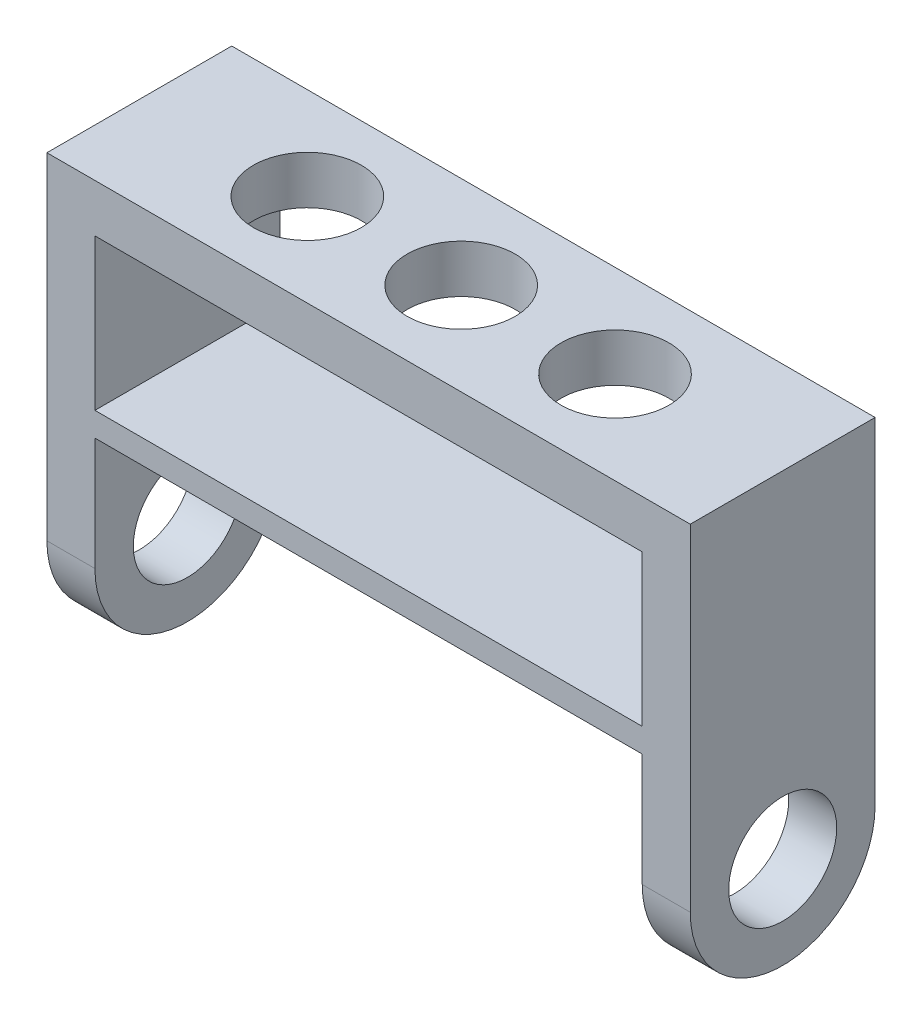
ISO-10303-21;
HEADER;
FILE_DESCRIPTION(('STEP AP214'),'2;1');
FILE_NAME('part.step','',(''),(''),'','','');
FILE_SCHEMA(('AUTOMOTIVE_DESIGN { 1 0 10303 214 1 1 1 1 }'));
ENDSEC;
DATA;
#1=APPLICATION_CONTEXT('core data for automotive mechanical design processes');
#2=APPLICATION_PROTOCOL_DEFINITION('international standard','automotive_design',2000,#1);
#3=PRODUCT_CONTEXT('',#1,'mechanical');
#4=PRODUCT('Part','Part','',(#3));
#5=PRODUCT_RELATED_PRODUCT_CATEGORY('part','',(#4));
#6=PRODUCT_DEFINITION_FORMATION('','',#4);
#7=PRODUCT_DEFINITION_CONTEXT('part definition',#1,'design');
#8=PRODUCT_DEFINITION('design','',#6,#7);
#9=PRODUCT_DEFINITION_SHAPE('','',#8);
#10=(LENGTH_UNIT() NAMED_UNIT(*) SI_UNIT(.MILLI.,.METRE.));
#11=(NAMED_UNIT(*) PLANE_ANGLE_UNIT() SI_UNIT($,.RADIAN.));
#12=(NAMED_UNIT(*) SI_UNIT($,.STERADIAN.) SOLID_ANGLE_UNIT());
#13=UNCERTAINTY_MEASURE_WITH_UNIT(LENGTH_MEASURE(1.E-05),#10,'distance_accuracy_value','');
#14=(GEOMETRIC_REPRESENTATION_CONTEXT(3) GLOBAL_UNCERTAINTY_ASSIGNED_CONTEXT((#13)) GLOBAL_UNIT_ASSIGNED_CONTEXT((#10,
#11,#12)) REPRESENTATION_CONTEXT('',''));
#15=CARTESIAN_POINT('',(0.,0.,0.));
#16=DIRECTION('',(0.,0.,1.));
#17=DIRECTION('',(1.,0.,0.));
#18=AXIS2_PLACEMENT_3D('',#15,#16,#17);
#19=CARTESIAN_POINT('',(0.,0.,0.));
#20=DIRECTION('',(1.,0.,0.));
#21=DIRECTION('',(0.,0.,-1.));
#22=AXIS2_PLACEMENT_3D('',#19,#20,#21);
#23=PLANE('',#22);
#24=DIRECTION('',(0.,0.,1.));
#25=VECTOR('',#24,1.);
#26=CARTESIAN_POINT('',(0.,76.2,-24.4475));
#27=LINE('',#26,#25);
#28=CARTESIAN_POINT('',(0.,76.2,-24.4475));
#29=VERTEX_POINT('',#28);
#30=CARTESIAN_POINT('',(0.,76.2,24.4475));
#31=VERTEX_POINT('',#30);
#32=EDGE_CURVE('E155',#29,#31,#27,.T.);
#33=ORIENTED_EDGE('',*,*,#32,.F.);
#34=DIRECTION('',(0.,1.,0.));
#35=VECTOR('',#34,1.);
#36=CARTESIAN_POINT('',(0.,0.,-24.4475));
#37=LINE('',#36,#35);
#38=CARTESIAN_POINT('',(0.,36.2318938321215,-24.4475));
#39=VERTEX_POINT('',#38);
#40=EDGE_CURVE('E58',#39,#29,#37,.T.);
#41=ORIENTED_EDGE('',*,*,#40,.F.);
#42=DIRECTION('',(0.,0.,-1.));
#43=VECTOR('',#42,1.);
#44=CARTESIAN_POINT('',(0.,36.2318938321215,-24.4475));
#45=LINE('',#44,#43);
#46=CARTESIAN_POINT('',(0.,36.2318938321215,24.4475));
#47=VERTEX_POINT('',#46);
#48=EDGE_CURVE('E173',#47,#39,#45,.T.);
#49=ORIENTED_EDGE('',*,*,#48,.F.);
#50=DIRECTION('',(0.,-1.,0.));
#51=VECTOR('',#50,1.);
#52=CARTESIAN_POINT('',(0.,0.,24.4475));
#53=LINE('',#52,#51);
#54=EDGE_CURVE('E202',#31,#47,#53,.T.);
#55=ORIENTED_EDGE('',*,*,#54,.F.);
#56=EDGE_LOOP('',(#33,#41,#49,#55));
#57=FACE_BOUND('',#56,.T.);
#58=ADVANCED_FACE('F33',(#57),#23,.F.);
#59=CARTESIAN_POINT('',(0.,0.,0.));
#60=DIRECTION('',(1.,0.,0.));
#61=DIRECTION('',(0.,0.,-1.));
#62=AXIS2_PLACEMENT_3D('',#59,#60,#61);
#63=CIRCLE('',#62,14.2875);
#64=CARTESIAN_POINT('',(0.,0.,-14.2875));
#65=VERTEX_POINT('',#64);
#66=EDGE_CURVE('E191',#65,#65,#63,.T.);
#67=ORIENTED_EDGE('',*,*,#66,.T.);
#68=EDGE_LOOP('',(#67));
#69=FACE_BOUND('',#68,.T.);
#70=DIRECTION('',(0.,0.,1.));
#71=VECTOR('',#70,1.);
#72=CARTESIAN_POINT('',(0.,29.8818938321215,-24.4475));
#73=LINE('',#72,#71);
#74=CARTESIAN_POINT('',(0.,29.8818938321215,-24.4475));
#75=VERTEX_POINT('',#74);
#76=CARTESIAN_POINT('',(0.,29.8818938321215,24.4475));
#77=VERTEX_POINT('',#76);
#78=EDGE_CURVE('E168',#75,#77,#73,.T.);
#79=ORIENTED_EDGE('',*,*,#78,.F.);
#80=CARTESIAN_POINT('',(0.,0.,-24.4475));
#81=VERTEX_POINT('',#80);
#82=EDGE_CURVE('E211',#81,#75,#37,.T.);
#83=ORIENTED_EDGE('',*,*,#82,.F.);
#84=CARTESIAN_POINT('',(0.,0.,0.));
#85=DIRECTION('',(1.,0.,0.));
#86=DIRECTION('',(0.,0.,-1.));
#87=AXIS2_PLACEMENT_3D('',#84,#85,#86);
#88=CIRCLE('',#87,24.4475);
#89=CARTESIAN_POINT('',(0.,0.,24.4475));
#90=VERTEX_POINT('',#89);
#91=EDGE_CURVE('E195',#90,#81,#88,.T.);
#92=ORIENTED_EDGE('',*,*,#91,.F.);
#93=EDGE_CURVE('E214',#77,#90,#53,.T.);
#94=ORIENTED_EDGE('',*,*,#93,.F.);
#95=EDGE_LOOP('',(#79,#83,#92,#94));
#96=FACE_BOUND('',#95,.T.);
#97=ADVANCED_FACE('F275',(#69,#96),#23,.F.);
#98=CARTESIAN_POINT('',(12.7,0.,0.));
#99=DIRECTION('',(1.,0.,0.));
#100=DIRECTION('',(0.,0.,-1.));
#101=AXIS2_PLACEMENT_3D('',#98,#99,#100);
#102=PLANE('',#101);
#103=CARTESIAN_POINT('',(12.7,0.,0.));
#104=DIRECTION('',(1.,0.,0.));
#105=DIRECTION('',(0.,0.,-1.));
#106=AXIS2_PLACEMENT_3D('',#103,#104,#105);
#107=CIRCLE('',#106,24.4475);
#108=CARTESIAN_POINT('',(12.7,0.,24.4475));
#109=VERTEX_POINT('',#108);
#110=CARTESIAN_POINT('',(12.7,0.,-24.4475));
#111=VERTEX_POINT('',#110);
#112=EDGE_CURVE('E198',#109,#111,#107,.T.);
#113=ORIENTED_EDGE('',*,*,#112,.T.);
#114=DIRECTION('',(0.,1.,0.));
#115=VECTOR('',#114,1.);
#116=CARTESIAN_POINT('',(12.7,0.,-24.4475));
#117=LINE('',#116,#115);
#118=CARTESIAN_POINT('',(12.7,88.9,-24.4475));
#119=VERTEX_POINT('',#118);
#120=EDGE_CURVE('E201',#111,#119,#117,.T.);
#121=ORIENTED_EDGE('',*,*,#120,.T.);
#122=DIRECTION('',(0.,0.,1.));
#123=VECTOR('',#122,1.);
#124=CARTESIAN_POINT('',(12.7,88.9,-24.4475));
#125=LINE('',#124,#123);
#126=CARTESIAN_POINT('',(12.7,88.9,24.4475));
#127=VERTEX_POINT('',#126);
#128=EDGE_CURVE('E204',#119,#127,#125,.T.);
#129=ORIENTED_EDGE('',*,*,#128,.T.);
#130=DIRECTION('',(0.,-1.,0.));
#131=VECTOR('',#130,1.);
#132=CARTESIAN_POINT('',(12.7,0.,24.4475));
#133=LINE('',#132,#131);
#134=EDGE_CURVE('E206',#127,#109,#133,.T.);
#135=ORIENTED_EDGE('',*,*,#134,.T.);
#136=EDGE_LOOP('',(#113,#121,#129,#135));
#137=FACE_BOUND('',#136,.T.);
#138=CARTESIAN_POINT('',(12.7,0.,0.));
#139=DIRECTION('',(1.,0.,0.));
#140=DIRECTION('',(0.,0.,-1.));
#141=AXIS2_PLACEMENT_3D('',#138,#139,#140);
#142=CIRCLE('',#141,14.2875);
#143=CARTESIAN_POINT('',(12.7,0.,-14.2875));
#144=VERTEX_POINT('',#143);
#145=EDGE_CURVE('E192',#144,#144,#142,.T.);
#146=ORIENTED_EDGE('',*,*,#145,.F.);
#147=EDGE_LOOP('',(#146));
#148=FACE_BOUND('',#147,.T.);
#149=ADVANCED_FACE('F279',(#137,#148),#102,.T.);
#150=CARTESIAN_POINT('',(12.7,0.,0.));
#151=DIRECTION('',(-1.,0.,0.));
#152=DIRECTION('',(0.,0.,1.));
#153=AXIS2_PLACEMENT_3D('',#150,#151,#152);
#154=CYLINDRICAL_SURFACE('',#153,24.4475);
#155=ORIENTED_EDGE('',*,*,#91,.T.);
#156=DIRECTION('',(-1.,0.,0.));
#157=VECTOR('',#156,1.);
#158=CARTESIAN_POINT('',(12.7,0.,-24.4475));
#159=LINE('',#158,#157);
#160=EDGE_CURVE('E11',#111,#81,#159,.T.);
#161=ORIENTED_EDGE('',*,*,#160,.F.);
#162=ORIENTED_EDGE('',*,*,#112,.F.);
#163=DIRECTION('',(-1.,0.,0.));
#164=VECTOR('',#163,1.);
#165=CARTESIAN_POINT('',(12.7,0.,24.4475));
#166=LINE('',#165,#164);
#167=EDGE_CURVE('E208',#109,#90,#166,.T.);
#168=ORIENTED_EDGE('',*,*,#167,.T.);
#169=EDGE_LOOP('',(#155,#161,#162,#168));
#170=FACE_BOUND('',#169,.T.);
#171=ADVANCED_FACE('F35',(#170),#154,.T.);
#172=CARTESIAN_POINT('',(12.7,0.,-24.4475));
#173=DIRECTION('',(0.,0.,1.));
#174=DIRECTION('',(1.,0.,0.));
#175=AXIS2_PLACEMENT_3D('',#172,#173,#174);
#176=PLANE('',#175);
#177=DIRECTION('',(1.,0.,0.));
#178=VECTOR('',#177,1.);
#179=CARTESIAN_POINT('',(-144.78,29.8818938321215,-24.4475));
#180=LINE('',#179,#178);
#181=CARTESIAN_POINT('',(-144.78,29.8818938321215,-24.4475));
#182=VERTEX_POINT('',#181);
#183=EDGE_CURVE('E188',#182,#75,#180,.T.);
#184=ORIENTED_EDGE('',*,*,#183,.F.);
#185=DIRECTION('',(0.,-1.,0.));
#186=VECTOR('',#185,1.);
#187=CARTESIAN_POINT('',(-144.78,0.,-24.4475));
#188=LINE('',#187,#186);
#189=CARTESIAN_POINT('',(-144.78,0.,-24.4475));
#190=VERTEX_POINT('',#189);
#191=EDGE_CURVE('E245',#182,#190,#188,.T.);
#192=ORIENTED_EDGE('',*,*,#191,.T.);
#193=DIRECTION('',(1.,0.,0.));
#194=VECTOR('',#193,1.);
#195=CARTESIAN_POINT('',(-157.48,0.,-24.4475));
#196=LINE('',#195,#194);
#197=CARTESIAN_POINT('',(-157.48,0.,-24.4475));
#198=VERTEX_POINT('',#197);
#199=EDGE_CURVE('E156',#198,#190,#196,.T.);
#200=ORIENTED_EDGE('',*,*,#199,.F.);
#201=DIRECTION('',(0.,-1.,0.));
#202=VECTOR('',#201,1.);
#203=CARTESIAN_POINT('',(-157.48,0.,-24.4475));
#204=LINE('',#203,#202);
#205=CARTESIAN_POINT('',(-157.48,88.9,-24.4475));
#206=VERTEX_POINT('',#205);
#207=EDGE_CURVE('E146',#206,#198,#204,.T.);
#208=ORIENTED_EDGE('',*,*,#207,.F.);
#209=DIRECTION('',(-1.,0.,0.));
#210=VECTOR('',#209,1.);
#211=CARTESIAN_POINT('',(12.7,88.9,-24.4475));
#212=LINE('',#211,#210);
#213=EDGE_CURVE('E42',#119,#206,#212,.T.);
#214=ORIENTED_EDGE('',*,*,#213,.F.);
#215=ORIENTED_EDGE('',*,*,#120,.F.);
#216=ORIENTED_EDGE('',*,*,#160,.T.);
#217=ORIENTED_EDGE('',*,*,#82,.T.);
#218=EDGE_LOOP('',(#184,#192,#200,#208,#214,#215,#216,#217));
#219=FACE_BOUND('',#218,.T.);
#220=CARTESIAN_POINT('',(-144.78,76.2,-24.4475));
#221=VERTEX_POINT('',#220);
#222=CARTESIAN_POINT('',(-144.78,36.2318938321215,-24.4475));
#223=VERTEX_POINT('',#222);
#224=EDGE_CURVE('E150',#221,#223,#188,.T.);
#225=ORIENTED_EDGE('',*,*,#224,.T.);
#226=DIRECTION('',(1.,0.,0.));
#227=VECTOR('',#226,1.);
#228=CARTESIAN_POINT('',(-144.78,36.2318938321215,-24.4475));
#229=LINE('',#228,#227);
#230=EDGE_CURVE('E176',#223,#39,#229,.T.);
#231=ORIENTED_EDGE('',*,*,#230,.T.);
#232=ORIENTED_EDGE('',*,*,#40,.T.);
#233=DIRECTION('',(1.,0.,0.));
#234=VECTOR('',#233,1.);
#235=CARTESIAN_POINT('',(-144.78,76.2,-24.4475));
#236=LINE('',#235,#234);
#237=EDGE_CURVE('E166',#221,#29,#236,.T.);
#238=ORIENTED_EDGE('',*,*,#237,.F.);
#239=EDGE_LOOP('',(#225,#231,#232,#238));
#240=FACE_BOUND('',#239,.T.);
#241=ADVANCED_FACE('F251',(#219,#240),#176,.F.);
#242=CARTESIAN_POINT('',(12.7,88.9,-24.4475));
#243=DIRECTION('',(0.,-1.,0.));
#244=DIRECTION('',(0.,0.,-1.));
#245=AXIS2_PLACEMENT_3D('',#242,#243,#244);
#246=PLANE('',#245);
#247=CARTESIAN_POINT('',(-113.03,88.9,0.));
#248=DIRECTION('',(0.,1.,0.));
#249=DIRECTION('',(0.,0.,1.));
#250=AXIS2_PLACEMENT_3D('',#247,#248,#249);
#251=CIRCLE('',#250,14.2875);
#252=CARTESIAN_POINT('',(-113.03,88.9,14.2875));
#253=VERTEX_POINT('',#252);
#254=EDGE_CURVE('E223',#253,#253,#251,.T.);
#255=ORIENTED_EDGE('',*,*,#254,.F.);
#256=EDGE_LOOP('',(#255));
#257=FACE_BOUND('',#256,.T.);
#258=CARTESIAN_POINT('',(-72.3392,88.9,0.));
#259=DIRECTION('',(0.,1.,0.));
#260=DIRECTION('',(0.,0.,1.));
#261=AXIS2_PLACEMENT_3D('',#258,#259,#260);
#262=CIRCLE('',#261,14.2875);
#263=CARTESIAN_POINT('',(-72.3392,88.9,14.2875));
#264=VERTEX_POINT('',#263);
#265=EDGE_CURVE('E320',#264,#264,#262,.T.);
#266=ORIENTED_EDGE('',*,*,#265,.F.);
#267=EDGE_LOOP('',(#266));
#268=FACE_BOUND('',#267,.T.);
#269=CARTESIAN_POINT('',(-31.6484,88.9,0.));
#270=DIRECTION('',(0.,1.,0.));
#271=DIRECTION('',(0.,0.,1.));
#272=AXIS2_PLACEMENT_3D('',#269,#270,#271);
#273=CIRCLE('',#272,14.2875);
#274=CARTESIAN_POINT('',(-31.6484,88.9,14.2875));
#275=VERTEX_POINT('',#274);
#276=EDGE_CURVE('E323',#275,#275,#273,.T.);
#277=ORIENTED_EDGE('',*,*,#276,.F.);
#278=EDGE_LOOP('',(#277));
#279=FACE_BOUND('',#278,.T.);
#280=ORIENTED_EDGE('',*,*,#213,.T.);
#281=DIRECTION('',(0.,0.,-1.));
#282=VECTOR('',#281,1.);
#283=CARTESIAN_POINT('',(-157.48,88.9,-24.4475));
#284=LINE('',#283,#282);
#285=CARTESIAN_POINT('',(-157.48,88.9,24.4475));
#286=VERTEX_POINT('',#285);
#287=EDGE_CURVE('E139',#286,#206,#284,.T.);
#288=ORIENTED_EDGE('',*,*,#287,.F.);
#289=DIRECTION('',(-1.,0.,0.));
#290=VECTOR('',#289,1.);
#291=CARTESIAN_POINT('',(12.7,88.9,24.4475));
#292=LINE('',#291,#290);
#293=EDGE_CURVE('E135',#127,#286,#292,.T.);
#294=ORIENTED_EDGE('',*,*,#293,.F.);
#295=ORIENTED_EDGE('',*,*,#128,.F.);
#296=EDGE_LOOP('',(#280,#288,#294,#295));
#297=FACE_BOUND('',#296,.T.);
#298=ADVANCED_FACE('F262',(#257,#268,#279,#297),#246,.F.);
#299=CARTESIAN_POINT('',(12.7,0.,24.4475));
#300=DIRECTION('',(0.,0.,-1.));
#301=DIRECTION('',(-1.,0.,0.));
#302=AXIS2_PLACEMENT_3D('',#299,#300,#301);
#303=PLANE('',#302);
#304=DIRECTION('',(1.,0.,0.));
#305=VECTOR('',#304,1.);
#306=CARTESIAN_POINT('',(-144.78,36.2318938321215,24.4475));
#307=LINE('',#306,#305);
#308=CARTESIAN_POINT('',(-144.78,36.2318938321215,24.4475));
#309=VERTEX_POINT('',#308);
#310=EDGE_CURVE('E182',#309,#47,#307,.T.);
#311=ORIENTED_EDGE('',*,*,#310,.F.);
#312=DIRECTION('',(0.,1.,0.));
#313=VECTOR('',#312,1.);
#314=CARTESIAN_POINT('',(-144.78,88.9,24.4475));
#315=LINE('',#314,#313);
#316=CARTESIAN_POINT('',(-144.78,76.2,24.4475));
#317=VERTEX_POINT('',#316);
#318=EDGE_CURVE('E243',#309,#317,#315,.T.);
#319=ORIENTED_EDGE('',*,*,#318,.T.);
#320=DIRECTION('',(1.,0.,0.));
#321=VECTOR('',#320,1.);
#322=CARTESIAN_POINT('',(-144.78,76.2,24.4475));
#323=LINE('',#322,#321);
#324=EDGE_CURVE('E50',#317,#31,#323,.T.);
#325=ORIENTED_EDGE('',*,*,#324,.T.);
#326=ORIENTED_EDGE('',*,*,#54,.T.);
#327=EDGE_LOOP('',(#311,#319,#325,#326));
#328=FACE_BOUND('',#327,.T.);
#329=ORIENTED_EDGE('',*,*,#293,.T.);
#330=DIRECTION('',(0.,1.,0.));
#331=VECTOR('',#330,1.);
#332=CARTESIAN_POINT('',(-157.48,88.9,24.4475));
#333=LINE('',#332,#331);
#334=CARTESIAN_POINT('',(-157.48,0.,24.4475));
#335=VERTEX_POINT('',#334);
#336=EDGE_CURVE('E126',#335,#286,#333,.T.);
#337=ORIENTED_EDGE('',*,*,#336,.F.);
#338=DIRECTION('',(1.,0.,0.));
#339=VECTOR('',#338,1.);
#340=CARTESIAN_POINT('',(-157.48,0.,24.4475));
#341=LINE('',#340,#339);
#342=CARTESIAN_POINT('',(-144.78,0.,24.4475));
#343=VERTEX_POINT('',#342);
#344=EDGE_CURVE('E131',#335,#343,#341,.T.);
#345=ORIENTED_EDGE('',*,*,#344,.T.);
#346=CARTESIAN_POINT('',(-144.78,29.8818938321215,24.4475));
#347=VERTEX_POINT('',#346);
#348=EDGE_CURVE('E244',#343,#347,#315,.T.);
#349=ORIENTED_EDGE('',*,*,#348,.T.);
#350=DIRECTION('',(1.,0.,0.));
#351=VECTOR('',#350,1.);
#352=CARTESIAN_POINT('',(-144.78,29.8818938321215,24.4475));
#353=LINE('',#352,#351);
#354=EDGE_CURVE('E185',#347,#77,#353,.T.);
#355=ORIENTED_EDGE('',*,*,#354,.T.);
#356=ORIENTED_EDGE('',*,*,#93,.T.);
#357=ORIENTED_EDGE('',*,*,#167,.F.);
#358=ORIENTED_EDGE('',*,*,#134,.F.);
#359=EDGE_LOOP('',(#329,#337,#345,#349,#355,#356,#357,#358));
#360=FACE_BOUND('',#359,.T.);
#361=ADVANCED_FACE('F128',(#328,#360),#303,.F.);
#362=CARTESIAN_POINT('',(12.7,0.,0.));
#363=DIRECTION('',(-1.,0.,0.));
#364=DIRECTION('',(0.,0.,1.));
#365=AXIS2_PLACEMENT_3D('',#362,#363,#364);
#366=CYLINDRICAL_SURFACE('',#365,14.2875);
#367=ORIENTED_EDGE('',*,*,#145,.T.);
#368=EDGE_LOOP('',(#367));
#369=FACE_BOUND('',#368,.T.);
#370=ORIENTED_EDGE('',*,*,#66,.F.);
#371=EDGE_LOOP('',(#370));
#372=FACE_BOUND('',#371,.T.);
#373=ADVANCED_FACE('F261',(#369,#372),#366,.F.);
#374=CARTESIAN_POINT('',(-144.78,29.8818938321215,-24.4475));
#375=DIRECTION('',(0.,1.,0.));
#376=DIRECTION('',(0.,0.,1.));
#377=AXIS2_PLACEMENT_3D('',#374,#375,#376);
#378=PLANE('',#377);
#379=ORIENTED_EDGE('',*,*,#78,.T.);
#380=ORIENTED_EDGE('',*,*,#354,.F.);
#381=DIRECTION('',(0.,0.,1.));
#382=VECTOR('',#381,1.);
#383=CARTESIAN_POINT('',(-144.78,29.8818938321215,-24.4475));
#384=LINE('',#383,#382);
#385=EDGE_CURVE('E169',#182,#347,#384,.T.);
#386=ORIENTED_EDGE('',*,*,#385,.F.);
#387=ORIENTED_EDGE('',*,*,#183,.T.);
#388=EDGE_LOOP('',(#379,#380,#386,#387));
#389=FACE_BOUND('',#388,.T.);
#390=ADVANCED_FACE('F268',(#389),#378,.F.);
#391=CARTESIAN_POINT('',(-144.78,36.2318938321215,-24.4475));
#392=DIRECTION('',(0.,-1.,0.));
#393=DIRECTION('',(0.,0.,-1.));
#394=AXIS2_PLACEMENT_3D('',#391,#392,#393);
#395=PLANE('',#394);
#396=ORIENTED_EDGE('',*,*,#48,.T.);
#397=ORIENTED_EDGE('',*,*,#230,.F.);
#398=DIRECTION('',(0.,0.,-1.));
#399=VECTOR('',#398,1.);
#400=CARTESIAN_POINT('',(-144.78,36.2318938321215,-24.4475));
#401=LINE('',#400,#399);
#402=EDGE_CURVE('E172',#309,#223,#401,.T.);
#403=ORIENTED_EDGE('',*,*,#402,.F.);
#404=ORIENTED_EDGE('',*,*,#310,.T.);
#405=EDGE_LOOP('',(#396,#397,#403,#404));
#406=FACE_BOUND('',#405,.T.);
#407=ADVANCED_FACE('F258',(#406),#395,.F.);
#408=CARTESIAN_POINT('',(-144.78,76.2,-24.4475));
#409=DIRECTION('',(0.,1.,0.));
#410=DIRECTION('',(0.,0.,1.));
#411=AXIS2_PLACEMENT_3D('',#408,#409,#410);
#412=PLANE('',#411);
#413=CARTESIAN_POINT('',(-113.03,76.2,0.));
#414=DIRECTION('',(0.,1.,0.));
#415=DIRECTION('',(0.,0.,1.));
#416=AXIS2_PLACEMENT_3D('',#413,#414,#415);
#417=CIRCLE('',#416,14.2875);
#418=CARTESIAN_POINT('',(-113.03,76.2,14.2875));
#419=VERTEX_POINT('',#418);
#420=EDGE_CURVE('E37',#419,#419,#417,.T.);
#421=ORIENTED_EDGE('',*,*,#420,.T.);
#422=EDGE_LOOP('',(#421));
#423=FACE_BOUND('',#422,.T.);
#424=CARTESIAN_POINT('',(-72.3392,76.2,0.));
#425=DIRECTION('',(0.,1.,0.));
#426=DIRECTION('',(0.,0.,1.));
#427=AXIS2_PLACEMENT_3D('',#424,#425,#426);
#428=CIRCLE('',#427,14.2875);
#429=CARTESIAN_POINT('',(-72.3392,76.2,14.2875));
#430=VERTEX_POINT('',#429);
#431=EDGE_CURVE('E222',#430,#430,#428,.T.);
#432=ORIENTED_EDGE('',*,*,#431,.T.);
#433=EDGE_LOOP('',(#432));
#434=FACE_BOUND('',#433,.T.);
#435=CARTESIAN_POINT('',(-31.6484,76.2,0.));
#436=DIRECTION('',(0.,1.,0.));
#437=DIRECTION('',(0.,0.,1.));
#438=AXIS2_PLACEMENT_3D('',#435,#436,#437);
#439=CIRCLE('',#438,14.2875);
#440=CARTESIAN_POINT('',(-31.6484,76.2,14.2875));
#441=VERTEX_POINT('',#440);
#442=EDGE_CURVE('E220',#441,#441,#439,.T.);
#443=ORIENTED_EDGE('',*,*,#442,.T.);
#444=EDGE_LOOP('',(#443));
#445=FACE_BOUND('',#444,.T.);
#446=ORIENTED_EDGE('',*,*,#32,.T.);
#447=ORIENTED_EDGE('',*,*,#324,.F.);
#448=DIRECTION('',(0.,0.,1.));
#449=VECTOR('',#448,1.);
#450=CARTESIAN_POINT('',(-144.78,76.2,-24.4475));
#451=LINE('',#450,#449);
#452=EDGE_CURVE('E158',#221,#317,#451,.T.);
#453=ORIENTED_EDGE('',*,*,#452,.F.);
#454=ORIENTED_EDGE('',*,*,#237,.T.);
#455=EDGE_LOOP('',(#446,#447,#453,#454));
#456=FACE_BOUND('',#455,.T.);
#457=ADVANCED_FACE('F290',(#423,#434,#445,#456),#412,.F.);
#458=CARTESIAN_POINT('',(-144.78,0.,0.));
#459=DIRECTION('',(-1.,0.,0.));
#460=DIRECTION('',(0.,0.,1.));
#461=AXIS2_PLACEMENT_3D('',#458,#459,#460);
#462=PLANE('',#461);
#463=CARTESIAN_POINT('',(-144.78,0.,0.));
#464=DIRECTION('',(-1.,0.,0.));
#465=DIRECTION('',(0.,0.,1.));
#466=AXIS2_PLACEMENT_3D('',#463,#464,#465);
#467=CIRCLE('',#466,14.2875);
#468=CARTESIAN_POINT('',(-144.78,0.,14.2875));
#469=VERTEX_POINT('',#468);
#470=EDGE_CURVE('E228',#469,#469,#467,.T.);
#471=ORIENTED_EDGE('',*,*,#470,.T.);
#472=EDGE_LOOP('',(#471));
#473=FACE_BOUND('',#472,.T.);
#474=ORIENTED_EDGE('',*,*,#191,.F.);
#475=ORIENTED_EDGE('',*,*,#385,.T.);
#476=ORIENTED_EDGE('',*,*,#348,.F.);
#477=CARTESIAN_POINT('',(-144.78,0.,0.));
#478=DIRECTION('',(-1.,0.,0.));
#479=DIRECTION('',(0.,0.,1.));
#480=AXIS2_PLACEMENT_3D('',#477,#478,#479);
#481=CIRCLE('',#480,24.4475);
#482=EDGE_CURVE('E154',#190,#343,#481,.T.);
#483=ORIENTED_EDGE('',*,*,#482,.F.);
#484=EDGE_LOOP('',(#474,#475,#476,#483));
#485=FACE_BOUND('',#484,.T.);
#486=ADVANCED_FACE('F293',(#473,#485),#462,.F.);
#487=ORIENTED_EDGE('',*,*,#318,.F.);
#488=ORIENTED_EDGE('',*,*,#402,.T.);
#489=ORIENTED_EDGE('',*,*,#224,.F.);
#490=ORIENTED_EDGE('',*,*,#452,.T.);
#491=EDGE_LOOP('',(#487,#488,#489,#490));
#492=FACE_BOUND('',#491,.T.);
#493=ADVANCED_FACE('F255',(#492),#462,.F.);
#494=CARTESIAN_POINT('',(-157.48,0.,0.));
#495=DIRECTION('',(-1.,0.,0.));
#496=DIRECTION('',(0.,0.,1.));
#497=AXIS2_PLACEMENT_3D('',#494,#495,#496);
#498=PLANE('',#497);
#499=CARTESIAN_POINT('',(-157.48,0.,0.));
#500=DIRECTION('',(-1.,0.,0.));
#501=DIRECTION('',(0.,0.,1.));
#502=AXIS2_PLACEMENT_3D('',#499,#500,#501);
#503=CIRCLE('',#502,24.4475);
#504=EDGE_CURVE('E140',#198,#335,#503,.T.);
#505=ORIENTED_EDGE('',*,*,#504,.T.);
#506=ORIENTED_EDGE('',*,*,#336,.T.);
#507=ORIENTED_EDGE('',*,*,#287,.T.);
#508=ORIENTED_EDGE('',*,*,#207,.T.);
#509=EDGE_LOOP('',(#505,#506,#507,#508));
#510=FACE_BOUND('',#509,.T.);
#511=CARTESIAN_POINT('',(-157.48,0.,0.));
#512=DIRECTION('',(-1.,0.,0.));
#513=DIRECTION('',(0.,0.,1.));
#514=AXIS2_PLACEMENT_3D('',#511,#512,#513);
#515=CIRCLE('',#514,14.2875);
#516=CARTESIAN_POINT('',(-157.48,0.,14.2875));
#517=VERTEX_POINT('',#516);
#518=EDGE_CURVE('E232',#517,#517,#515,.T.);
#519=ORIENTED_EDGE('',*,*,#518,.F.);
#520=EDGE_LOOP('',(#519));
#521=FACE_BOUND('',#520,.T.);
#522=ADVANCED_FACE('F143',(#510,#521),#498,.T.);
#523=CARTESIAN_POINT('',(-157.48,0.,0.));
#524=DIRECTION('',(1.,0.,0.));
#525=DIRECTION('',(0.,0.,-1.));
#526=AXIS2_PLACEMENT_3D('',#523,#524,#525);
#527=CYLINDRICAL_SURFACE('',#526,24.4475);
#528=ORIENTED_EDGE('',*,*,#482,.T.);
#529=ORIENTED_EDGE('',*,*,#344,.F.);
#530=ORIENTED_EDGE('',*,*,#504,.F.);
#531=ORIENTED_EDGE('',*,*,#199,.T.);
#532=EDGE_LOOP('',(#528,#529,#530,#531));
#533=FACE_BOUND('',#532,.T.);
#534=ADVANCED_FACE('F152',(#533),#527,.T.);
#535=CARTESIAN_POINT('',(-157.48,0.,0.));
#536=DIRECTION('',(1.,0.,0.));
#537=DIRECTION('',(0.,0.,-1.));
#538=AXIS2_PLACEMENT_3D('',#535,#536,#537);
#539=CYLINDRICAL_SURFACE('',#538,14.2875);
#540=ORIENTED_EDGE('',*,*,#518,.T.);
#541=EDGE_LOOP('',(#540));
#542=FACE_BOUND('',#541,.T.);
#543=ORIENTED_EDGE('',*,*,#470,.F.);
#544=EDGE_LOOP('',(#543));
#545=FACE_BOUND('',#544,.T.);
#546=ADVANCED_FACE('F296',(#542,#545),#539,.F.);
#547=CARTESIAN_POINT('',(-31.6484,63.246,0.));
#548=DIRECTION('',(0.,1.,0.));
#549=DIRECTION('',(0.,0.,1.));
#550=AXIS2_PLACEMENT_3D('',#547,#548,#549);
#551=CYLINDRICAL_SURFACE('',#550,14.2875);
#552=ORIENTED_EDGE('',*,*,#276,.T.);
#553=EDGE_LOOP('',(#552));
#554=FACE_BOUND('',#553,.T.);
#555=ORIENTED_EDGE('',*,*,#442,.F.);
#556=EDGE_LOOP('',(#555));
#557=FACE_BOUND('',#556,.T.);
#558=ADVANCED_FACE('F303',(#554,#557),#551,.F.);
#559=CARTESIAN_POINT('',(-72.3392,63.246,0.));
#560=DIRECTION('',(0.,1.,0.));
#561=DIRECTION('',(0.,0.,1.));
#562=AXIS2_PLACEMENT_3D('',#559,#560,#561);
#563=CYLINDRICAL_SURFACE('',#562,14.2875);
#564=ORIENTED_EDGE('',*,*,#265,.T.);
#565=EDGE_LOOP('',(#564));
#566=FACE_BOUND('',#565,.T.);
#567=ORIENTED_EDGE('',*,*,#431,.F.);
#568=EDGE_LOOP('',(#567));
#569=FACE_BOUND('',#568,.T.);
#570=ADVANCED_FACE('F307',(#566,#569),#563,.F.);
#571=CARTESIAN_POINT('',(-113.03,63.246,0.));
#572=DIRECTION('',(0.,1.,0.));
#573=DIRECTION('',(0.,0.,1.));
#574=AXIS2_PLACEMENT_3D('',#571,#572,#573);
#575=CYLINDRICAL_SURFACE('',#574,14.2875);
#576=ORIENTED_EDGE('',*,*,#254,.T.);
#577=EDGE_LOOP('',(#576));
#578=FACE_BOUND('',#577,.T.);
#579=ORIENTED_EDGE('',*,*,#420,.F.);
#580=EDGE_LOOP('',(#579));
#581=FACE_BOUND('',#580,.T.);
#582=ADVANCED_FACE('F311',(#578,#581),#575,.F.);
#583=CLOSED_SHELL('',(#58,#97,#149,#171,#241,#298,#361,#373,#390,#407,#457,#486,#493,#522,#534,
#546,#558,#570,#582));
#584=MANIFOLD_SOLID_BREP('B2',#583);
#585=ADVANCED_BREP_SHAPE_REPRESENTATION('',(#18,#584),#14);
#586=SHAPE_DEFINITION_REPRESENTATION(#9,#585);
ENDSEC;
END-ISO-10303-21;
